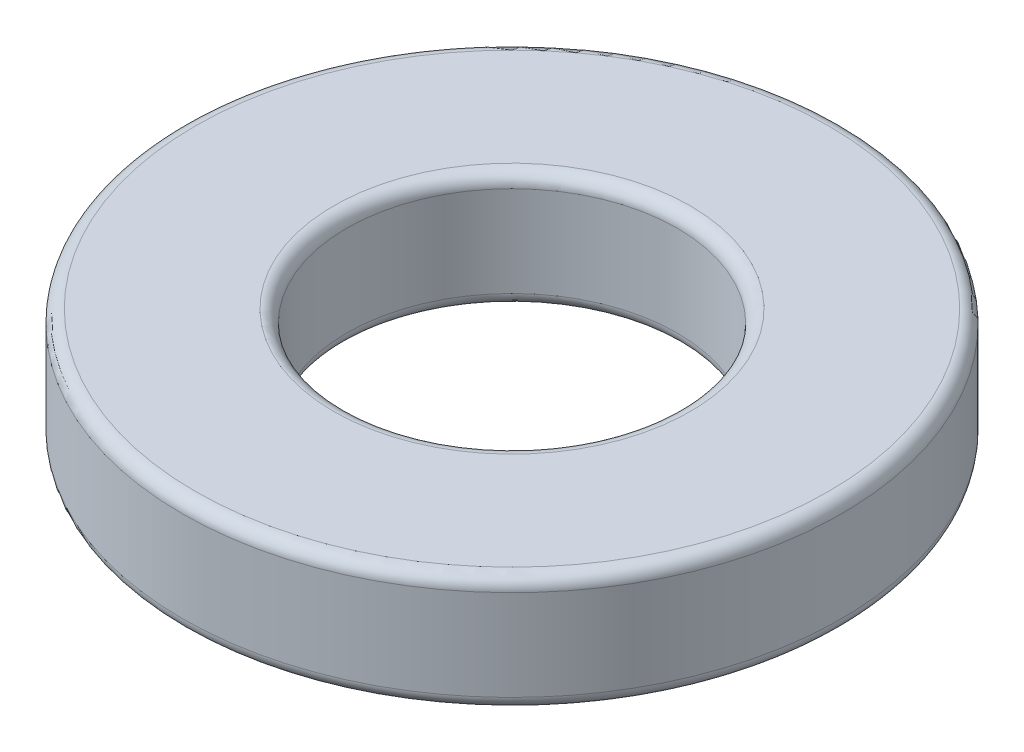
ISO-10303-21;
HEADER;
FILE_DESCRIPTION(('STEP AP214'),'2;1');
FILE_NAME('part.step','',(''),(''),'','','');
FILE_SCHEMA(('AUTOMOTIVE_DESIGN { 1 0 10303 214 1 1 1 1 }'));
ENDSEC;
DATA;
#1=APPLICATION_CONTEXT('core data for automotive mechanical design processes');
#2=APPLICATION_PROTOCOL_DEFINITION('international standard','automotive_design',2000,#1);
#3=PRODUCT_CONTEXT('',#1,'mechanical');
#4=PRODUCT('Part','Part','',(#3));
#5=PRODUCT_RELATED_PRODUCT_CATEGORY('part','',(#4));
#6=PRODUCT_DEFINITION_FORMATION('','',#4);
#7=PRODUCT_DEFINITION_CONTEXT('part definition',#1,'design');
#8=PRODUCT_DEFINITION('design','',#6,#7);
#9=PRODUCT_DEFINITION_SHAPE('','',#8);
#10=(LENGTH_UNIT() NAMED_UNIT(*) SI_UNIT(.MILLI.,.METRE.));
#11=(NAMED_UNIT(*) PLANE_ANGLE_UNIT() SI_UNIT($,.RADIAN.));
#12=(NAMED_UNIT(*) SI_UNIT($,.STERADIAN.) SOLID_ANGLE_UNIT());
#13=UNCERTAINTY_MEASURE_WITH_UNIT(LENGTH_MEASURE(1.E-05),#10,'distance_accuracy_value','');
#14=(GEOMETRIC_REPRESENTATION_CONTEXT(3) GLOBAL_UNCERTAINTY_ASSIGNED_CONTEXT((#13)) GLOBAL_UNIT_ASSIGNED_CONTEXT((#10,
#11,#12)) REPRESENTATION_CONTEXT('',''));
#15=CARTESIAN_POINT('',(0.,0.,0.));
#16=DIRECTION('',(0.,0.,1.));
#17=DIRECTION('',(1.,0.,0.));
#18=AXIS2_PLACEMENT_3D('',#15,#16,#17);
#19=CARTESIAN_POINT('',(0.,9.,0.));
#20=DIRECTION('',(0.,1.,0.));
#21=DIRECTION('',(0.,0.,1.));
#22=AXIS2_PLACEMENT_3D('',#19,#20,#21);
#23=PLANE('',#22);
#24=CARTESIAN_POINT('',(0.,9.,0.));
#25=DIRECTION('',(0.,1.,0.));
#26=DIRECTION('',(0.,0.,1.));
#27=AXIS2_PLACEMENT_3D('',#24,#25,#26);
#28=CIRCLE('',#27,13.75);
#29=CARTESIAN_POINT('',(0.,9.,13.75));
#30=VERTEX_POINT('',#29);
#31=EDGE_CURVE('E48',#30,#30,#28,.F.);
#32=ORIENTED_EDGE('',*,*,#31,.T.);
#33=EDGE_LOOP('',(#32));
#34=FACE_BOUND('',#33,.T.);
#35=CARTESIAN_POINT('',(0.,9.,0.));
#36=DIRECTION('',(0.,1.,0.));
#37=DIRECTION('',(0.,0.,1.));
#38=AXIS2_PLACEMENT_3D('',#35,#36,#37);
#39=CIRCLE('',#38,24.425);
#40=CARTESIAN_POINT('',(0.,9.,24.425));
#41=VERTEX_POINT('',#40);
#42=EDGE_CURVE('E52',#41,#41,#39,.T.);
#43=ORIENTED_EDGE('',*,*,#42,.T.);
#44=EDGE_LOOP('',(#43));
#45=FACE_BOUND('',#44,.T.);
#46=ADVANCED_FACE('F37',(#34,#45),#23,.T.);
#47=CARTESIAN_POINT('',(0.,0.,0.));
#48=DIRECTION('',(0.,1.,0.));
#49=DIRECTION('',(0.,0.,1.));
#50=AXIS2_PLACEMENT_3D('',#47,#48,#49);
#51=PLANE('',#50);
#52=CARTESIAN_POINT('',(0.,0.,0.));
#53=DIRECTION('',(0.,1.,0.));
#54=DIRECTION('',(0.,0.,1.));
#55=AXIS2_PLACEMENT_3D('',#52,#53,#54);
#56=CIRCLE('',#55,13.75);
#57=CARTESIAN_POINT('',(0.,0.,13.75));
#58=VERTEX_POINT('',#57);
#59=EDGE_CURVE('E63',#58,#58,#56,.T.);
#60=ORIENTED_EDGE('',*,*,#59,.T.);
#61=EDGE_LOOP('',(#60));
#62=FACE_BOUND('',#61,.T.);
#63=CARTESIAN_POINT('',(0.,0.,0.));
#64=DIRECTION('',(0.,1.,0.));
#65=DIRECTION('',(0.,0.,1.));
#66=AXIS2_PLACEMENT_3D('',#63,#64,#65);
#67=CIRCLE('',#66,24.425);
#68=CARTESIAN_POINT('',(0.,0.,24.425));
#69=VERTEX_POINT('',#68);
#70=EDGE_CURVE('E66',#69,#69,#67,.F.);
#71=ORIENTED_EDGE('',*,*,#70,.T.);
#72=EDGE_LOOP('',(#71));
#73=FACE_BOUND('',#72,.T.);
#74=ADVANCED_FACE('F70',(#62,#73),#51,.F.);
#75=CARTESIAN_POINT('',(0.,9.,0.));
#76=DIRECTION('',(0.,-1.,0.));
#77=DIRECTION('',(0.,0.,-1.));
#78=AXIS2_PLACEMENT_3D('',#75,#76,#77);
#79=CYLINDRICAL_SURFACE('',#78,25.425);
#80=CARTESIAN_POINT('',(0.,0.999999999999999,0.));
#81=DIRECTION('',(0.,1.,0.));
#82=DIRECTION('',(0.,0.,1.));
#83=AXIS2_PLACEMENT_3D('',#80,#81,#82);
#84=CIRCLE('',#83,25.425);
#85=CARTESIAN_POINT('',(0.,0.999999999999999,25.425));
#86=VERTEX_POINT('',#85);
#87=EDGE_CURVE('E10',#86,#86,#84,.T.);
#88=ORIENTED_EDGE('',*,*,#87,.T.);
#89=EDGE_LOOP('',(#88));
#90=FACE_BOUND('',#89,.T.);
#91=CARTESIAN_POINT('',(0.,8.,0.));
#92=DIRECTION('',(0.,1.,0.));
#93=DIRECTION('',(0.,0.,1.));
#94=AXIS2_PLACEMENT_3D('',#91,#92,#93);
#95=CIRCLE('',#94,25.425);
#96=CARTESIAN_POINT('',(0.,8.,25.425));
#97=VERTEX_POINT('',#96);
#98=EDGE_CURVE('E44',#97,#97,#95,.F.);
#99=ORIENTED_EDGE('',*,*,#98,.T.);
#100=EDGE_LOOP('',(#99));
#101=FACE_BOUND('',#100,.T.);
#102=ADVANCED_FACE('F90',(#90,#101),#79,.T.);
#103=CARTESIAN_POINT('',(0.,9.,0.));
#104=DIRECTION('',(0.,-1.,0.));
#105=DIRECTION('',(0.,0.,-1.));
#106=AXIS2_PLACEMENT_3D('',#103,#104,#105);
#107=CYLINDRICAL_SURFACE('',#106,12.75);
#108=CARTESIAN_POINT('',(0.,0.999999999999999,0.));
#109=DIRECTION('',(0.,1.,0.));
#110=DIRECTION('',(0.,0.,1.));
#111=AXIS2_PLACEMENT_3D('',#108,#109,#110);
#112=CIRCLE('',#111,12.75);
#113=CARTESIAN_POINT('',(0.,0.999999999999999,12.75));
#114=VERTEX_POINT('',#113);
#115=EDGE_CURVE('E57',#114,#114,#112,.F.);
#116=ORIENTED_EDGE('',*,*,#115,.T.);
#117=EDGE_LOOP('',(#116));
#118=FACE_BOUND('',#117,.T.);
#119=CARTESIAN_POINT('',(0.,8.,0.));
#120=DIRECTION('',(0.,1.,0.));
#121=DIRECTION('',(0.,0.,1.));
#122=AXIS2_PLACEMENT_3D('',#119,#120,#121);
#123=CIRCLE('',#122,12.75);
#124=CARTESIAN_POINT('',(0.,8.,12.75));
#125=VERTEX_POINT('',#124);
#126=EDGE_CURVE('E60',#125,#125,#123,.T.);
#127=ORIENTED_EDGE('',*,*,#126,.T.);
#128=EDGE_LOOP('',(#127));
#129=FACE_BOUND('',#128,.T.);
#130=ADVANCED_FACE('F95',(#118,#129),#107,.F.);
#131=CARTESIAN_POINT('',(0.,0.999999999999999,0.));
#132=DIRECTION('',(0.,1.,0.));
#133=DIRECTION('',(0.,0.,1.));
#134=AXIS2_PLACEMENT_3D('',#131,#132,#133);
#135=TOROIDAL_SURFACE('',#134,13.75,1.);
#136=ORIENTED_EDGE('',*,*,#115,.F.);
#137=EDGE_LOOP('',(#136));
#138=FACE_BOUND('',#137,.T.);
#139=ORIENTED_EDGE('',*,*,#59,.F.);
#140=EDGE_LOOP('',(#139));
#141=FACE_BOUND('',#140,.T.);
#142=ADVANCED_FACE('F81',(#138,#141),#135,.T.);
#143=CARTESIAN_POINT('',(0.,8.,0.));
#144=DIRECTION('',(0.,1.,0.));
#145=DIRECTION('',(0.,0.,1.));
#146=AXIS2_PLACEMENT_3D('',#143,#144,#145);
#147=TOROIDAL_SURFACE('',#146,13.75,1.);
#148=ORIENTED_EDGE('',*,*,#31,.F.);
#149=EDGE_LOOP('',(#148));
#150=FACE_BOUND('',#149,.T.);
#151=ORIENTED_EDGE('',*,*,#126,.F.);
#152=EDGE_LOOP('',(#151));
#153=FACE_BOUND('',#152,.T.);
#154=ADVANCED_FACE('F75',(#150,#153),#147,.T.);
#155=CARTESIAN_POINT('',(0.,0.999999999999999,0.));
#156=DIRECTION('',(0.,1.,0.));
#157=DIRECTION('',(0.,0.,1.));
#158=AXIS2_PLACEMENT_3D('',#155,#156,#157);
#159=TOROIDAL_SURFACE('',#158,24.425,1.);
#160=ORIENTED_EDGE('',*,*,#70,.F.);
#161=EDGE_LOOP('',(#160));
#162=FACE_BOUND('',#161,.T.);
#163=ORIENTED_EDGE('',*,*,#87,.F.);
#164=EDGE_LOOP('',(#163));
#165=FACE_BOUND('',#164,.T.);
#166=ADVANCED_FACE('F72',(#162,#165),#159,.T.);
#167=CARTESIAN_POINT('',(0.,8.,0.));
#168=DIRECTION('',(0.,1.,0.));
#169=DIRECTION('',(0.,0.,1.));
#170=AXIS2_PLACEMENT_3D('',#167,#168,#169);
#171=TOROIDAL_SURFACE('',#170,24.425,1.);
#172=ORIENTED_EDGE('',*,*,#98,.F.);
#173=EDGE_LOOP('',(#172));
#174=FACE_BOUND('',#173,.T.);
#175=ORIENTED_EDGE('',*,*,#42,.F.);
#176=EDGE_LOOP('',(#175));
#177=FACE_BOUND('',#176,.T.);
#178=ADVANCED_FACE('F39',(#174,#177),#171,.T.);
#179=CLOSED_SHELL('',(#46,#74,#102,#130,#142,#154,#166,#178));
#180=MANIFOLD_SOLID_BREP('B2',#179);
#181=ADVANCED_BREP_SHAPE_REPRESENTATION('',(#18,#180),#14);
#182=SHAPE_DEFINITION_REPRESENTATION(#9,#181);
ENDSEC;
END-ISO-10303-21;
